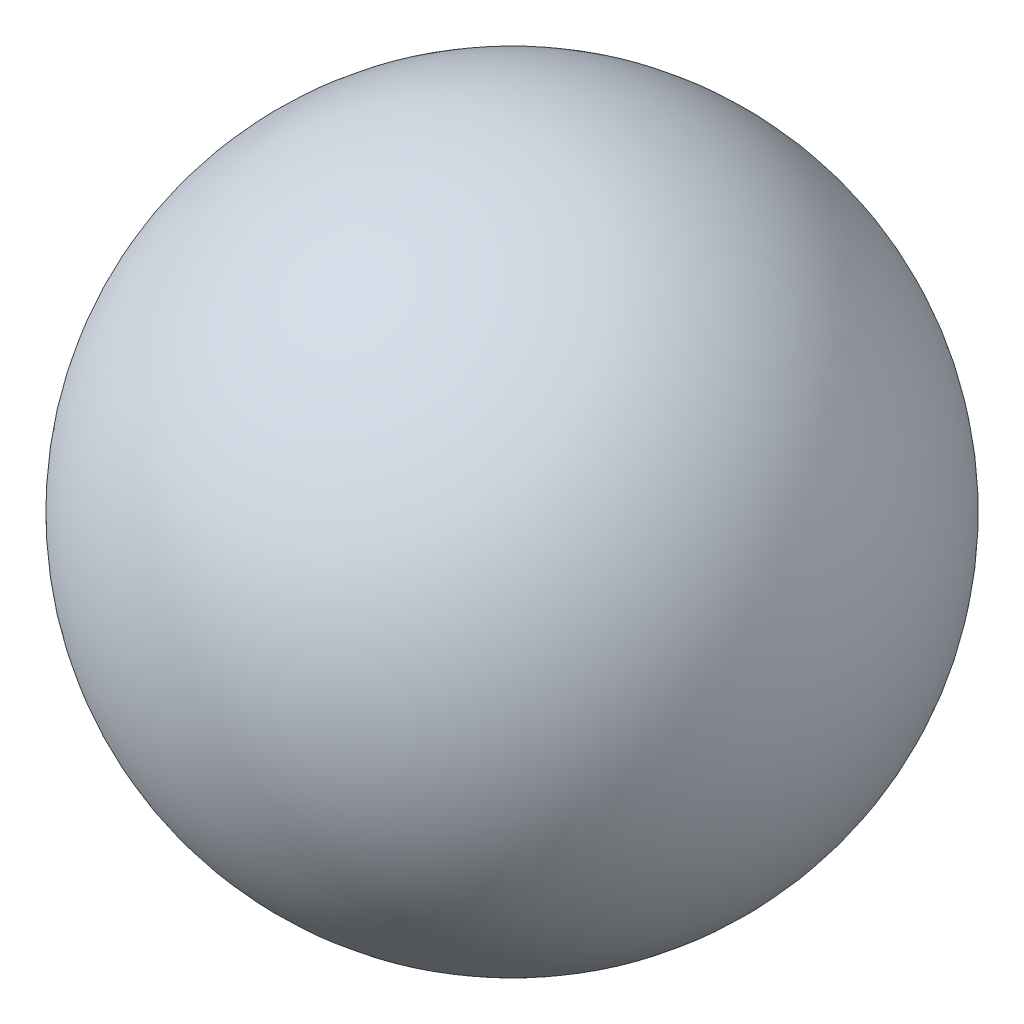
ISO-10303-21;
HEADER;
FILE_DESCRIPTION(('STEP AP214'),'2;1');
FILE_NAME('part.step','',(''),(''),'','','');
FILE_SCHEMA(('AUTOMOTIVE_DESIGN { 1 0 10303 214 1 1 1 1 }'));
ENDSEC;
DATA;
#1=APPLICATION_CONTEXT('core data for automotive mechanical design processes');
#2=APPLICATION_PROTOCOL_DEFINITION('international standard','automotive_design',2000,#1);
#3=PRODUCT_CONTEXT('',#1,'mechanical');
#4=PRODUCT('Part','Part','',(#3));
#5=PRODUCT_RELATED_PRODUCT_CATEGORY('part','',(#4));
#6=PRODUCT_DEFINITION_FORMATION('','',#4);
#7=PRODUCT_DEFINITION_CONTEXT('part definition',#1,'design');
#8=PRODUCT_DEFINITION('design','',#6,#7);
#9=PRODUCT_DEFINITION_SHAPE('','',#8);
#10=(LENGTH_UNIT() NAMED_UNIT(*) SI_UNIT(.MILLI.,.METRE.));
#11=(NAMED_UNIT(*) PLANE_ANGLE_UNIT() SI_UNIT($,.RADIAN.));
#12=(NAMED_UNIT(*) SI_UNIT($,.STERADIAN.) SOLID_ANGLE_UNIT());
#13=UNCERTAINTY_MEASURE_WITH_UNIT(LENGTH_MEASURE(1.E-05),#10,'distance_accuracy_value','');
#14=(GEOMETRIC_REPRESENTATION_CONTEXT(3) GLOBAL_UNCERTAINTY_ASSIGNED_CONTEXT((#13)) GLOBAL_UNIT_ASSIGNED_CONTEXT((#10,
#11,#12)) REPRESENTATION_CONTEXT('',''));
#15=CARTESIAN_POINT('',(0.,0.,0.));
#16=DIRECTION('',(0.,0.,1.));
#17=DIRECTION('',(1.,0.,0.));
#18=AXIS2_PLACEMENT_3D('',#15,#16,#17);
#19=CARTESIAN_POINT('',(0.,0.,0.));
#20=DIRECTION('',(0.,1.,0.));
#21=DIRECTION('',(1.,0.,0.));
#22=AXIS2_PLACEMENT_3D('',#19,#20,#21);
#23=SPHERICAL_SURFACE('',#22,8.);
#24=CARTESIAN_POINT('',(0.,8.,0.));
#25=VERTEX_POINT('',#24);
#26=VERTEX_LOOP('',#25);
#27=FACE_BOUND('',#26,.T.);
#28=ADVANCED_FACE('F29',(#27),#23,.T.);
#29=CLOSED_SHELL('',(#28));
#30=MANIFOLD_SOLID_BREP('B2',#29);
#31=ADVANCED_BREP_SHAPE_REPRESENTATION('',(#18,#30),#14);
#32=SHAPE_DEFINITION_REPRESENTATION(#9,#31);
ENDSEC;
END-ISO-10303-21;
